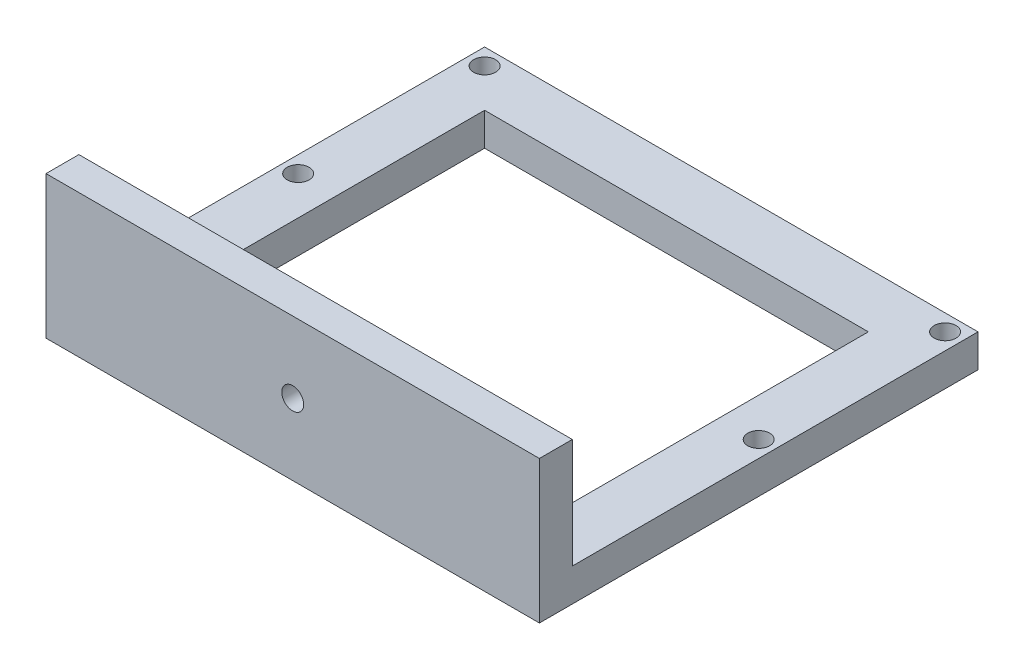
ISO-10303-21;
HEADER;
FILE_DESCRIPTION(('STEP AP214'),'2;1');
FILE_NAME('part.step','',(''),(''),'','','');
FILE_SCHEMA(('AUTOMOTIVE_DESIGN { 1 0 10303 214 1 1 1 1 }'));
ENDSEC;
DATA;
#1=APPLICATION_CONTEXT('core data for automotive mechanical design processes');
#2=APPLICATION_PROTOCOL_DEFINITION('international standard','automotive_design',2000,#1);
#3=PRODUCT_CONTEXT('',#1,'mechanical');
#4=PRODUCT('Part','Part','',(#3));
#5=PRODUCT_RELATED_PRODUCT_CATEGORY('part','',(#4));
#6=PRODUCT_DEFINITION_FORMATION('','',#4);
#7=PRODUCT_DEFINITION_CONTEXT('part definition',#1,'design');
#8=PRODUCT_DEFINITION('design','',#6,#7);
#9=PRODUCT_DEFINITION_SHAPE('','',#8);
#10=(LENGTH_UNIT() NAMED_UNIT(*) SI_UNIT(.MILLI.,.METRE.));
#11=(NAMED_UNIT(*) PLANE_ANGLE_UNIT() SI_UNIT($,.RADIAN.));
#12=(NAMED_UNIT(*) SI_UNIT($,.STERADIAN.) SOLID_ANGLE_UNIT());
#13=UNCERTAINTY_MEASURE_WITH_UNIT(LENGTH_MEASURE(1.E-05),#10,'distance_accuracy_value','');
#14=(GEOMETRIC_REPRESENTATION_CONTEXT(3) GLOBAL_UNCERTAINTY_ASSIGNED_CONTEXT((#13)) GLOBAL_UNIT_ASSIGNED_CONTEXT((#10,
#11,#12)) REPRESENTATION_CONTEXT('',''));
#15=CARTESIAN_POINT('',(0.,0.,0.));
#16=DIRECTION('',(0.,0.,1.));
#17=DIRECTION('',(1.,0.,0.));
#18=AXIS2_PLACEMENT_3D('',#15,#16,#17);
#19=CARTESIAN_POINT('',(0.,3.,-35.));
#20=DIRECTION('',(0.,0.,-1.));
#21=DIRECTION('',(-1.,0.,0.));
#22=AXIS2_PLACEMENT_3D('',#19,#20,#21);
#23=PLANE('',#22);
#24=DIRECTION('',(1.,0.,0.));
#25=VECTOR('',#24,1.);
#26=CARTESIAN_POINT('',(0.,0.,-35.));
#27=LINE('',#26,#25);
#28=CARTESIAN_POINT('',(-40.,0.,-35.));
#29=VERTEX_POINT('',#28);
#30=CARTESIAN_POINT('',(-5.,0.,-35.));
#31=VERTEX_POINT('',#30);
#32=EDGE_CURVE('E168',#29,#31,#27,.T.);
#33=ORIENTED_EDGE('',*,*,#32,.T.);
#34=DIRECTION('',(0.,-1.,0.));
#35=VECTOR('',#34,1.);
#36=CARTESIAN_POINT('',(-5.,3.,-35.));
#37=LINE('',#36,#35);
#38=CARTESIAN_POINT('',(-5.,3.,-35.));
#39=VERTEX_POINT('',#38);
#40=EDGE_CURVE('E11',#39,#31,#37,.T.);
#41=ORIENTED_EDGE('',*,*,#40,.F.);
#42=DIRECTION('',(1.,0.,0.));
#43=VECTOR('',#42,1.);
#44=CARTESIAN_POINT('',(0.,3.,-35.));
#45=LINE('',#44,#43);
#46=CARTESIAN_POINT('',(-40.,3.,-35.));
#47=VERTEX_POINT('',#46);
#48=EDGE_CURVE('E139',#47,#39,#45,.T.);
#49=ORIENTED_EDGE('',*,*,#48,.F.);
#50=DIRECTION('',(0.,-1.,0.));
#51=VECTOR('',#50,1.);
#52=CARTESIAN_POINT('',(-40.,3.,-35.));
#53=LINE('',#52,#51);
#54=EDGE_CURVE('E179',#47,#29,#53,.T.);
#55=ORIENTED_EDGE('',*,*,#54,.T.);
#56=EDGE_LOOP('',(#33,#41,#49,#55));
#57=FACE_BOUND('',#56,.T.);
#58=ADVANCED_FACE('F47',(#57),#23,.F.);
#59=CARTESIAN_POINT('',(-5.,3.,0.));
#60=DIRECTION('',(-1.,0.,0.));
#61=DIRECTION('',(0.,0.,1.));
#62=AXIS2_PLACEMENT_3D('',#59,#60,#61);
#63=PLANE('',#62);
#64=DIRECTION('',(0.,0.,-1.));
#65=VECTOR('',#64,1.);
#66=CARTESIAN_POINT('',(-5.,0.,0.));
#67=LINE('',#66,#65);
#68=CARTESIAN_POINT('',(-5.,0.,-4.99999999999999));
#69=VERTEX_POINT('',#68);
#70=EDGE_CURVE('E128',#69,#31,#67,.T.);
#71=ORIENTED_EDGE('',*,*,#70,.F.);
#72=DIRECTION('',(0.,-1.,0.));
#73=VECTOR('',#72,1.);
#74=CARTESIAN_POINT('',(-5.,3.,-4.99999999999999));
#75=LINE('',#74,#73);
#76=CARTESIAN_POINT('',(-5.,3.,-4.99999999999999));
#77=VERTEX_POINT('',#76);
#78=EDGE_CURVE('E57',#77,#69,#75,.T.);
#79=ORIENTED_EDGE('',*,*,#78,.F.);
#80=DIRECTION('',(0.,0.,-1.));
#81=VECTOR('',#80,1.);
#82=CARTESIAN_POINT('',(-5.,3.,0.));
#83=LINE('',#82,#81);
#84=EDGE_CURVE('E126',#77,#39,#83,.T.);
#85=ORIENTED_EDGE('',*,*,#84,.T.);
#86=ORIENTED_EDGE('',*,*,#40,.T.);
#87=EDGE_LOOP('',(#71,#79,#85,#86));
#88=FACE_BOUND('',#87,.T.);
#89=ADVANCED_FACE('F125',(#88),#63,.T.);
#90=CARTESIAN_POINT('',(0.,3.,-4.99999999999999));
#91=DIRECTION('',(0.,0.,-1.));
#92=DIRECTION('',(-1.,0.,0.));
#93=AXIS2_PLACEMENT_3D('',#90,#91,#92);
#94=PLANE('',#93);
#95=DIRECTION('',(1.,0.,0.));
#96=VECTOR('',#95,1.);
#97=CARTESIAN_POINT('',(0.,0.,-4.99999999999999));
#98=LINE('',#97,#96);
#99=CARTESIAN_POINT('',(-40.,0.,-4.99999999999999));
#100=VERTEX_POINT('',#99);
#101=EDGE_CURVE('E174',#100,#69,#98,.T.);
#102=ORIENTED_EDGE('',*,*,#101,.F.);
#103=DIRECTION('',(0.,-1.,0.));
#104=VECTOR('',#103,1.);
#105=CARTESIAN_POINT('',(-40.,3.,-4.99999999999999));
#106=LINE('',#105,#104);
#107=CARTESIAN_POINT('',(-40.,3.,-4.99999999999999));
#108=VERTEX_POINT('',#107);
#109=EDGE_CURVE('E134',#108,#100,#106,.T.);
#110=ORIENTED_EDGE('',*,*,#109,.F.);
#111=DIRECTION('',(1.,0.,0.));
#112=VECTOR('',#111,1.);
#113=CARTESIAN_POINT('',(0.,3.,-4.99999999999999));
#114=LINE('',#113,#112);
#115=EDGE_CURVE('E137',#108,#77,#114,.T.);
#116=ORIENTED_EDGE('',*,*,#115,.T.);
#117=ORIENTED_EDGE('',*,*,#78,.T.);
#118=EDGE_LOOP('',(#102,#110,#116,#117));
#119=FACE_BOUND('',#118,.T.);
#120=ADVANCED_FACE('F143',(#119),#94,.T.);
#121=CARTESIAN_POINT('',(0.,3.,0.));
#122=DIRECTION('',(-1.,0.,0.));
#123=DIRECTION('',(0.,0.,1.));
#124=AXIS2_PLACEMENT_3D('',#121,#122,#123);
#125=PLANE('',#124);
#126=DIRECTION('',(0.,0.,-1.));
#127=VECTOR('',#126,1.);
#128=CARTESIAN_POINT('',(0.,0.,0.));
#129=LINE('',#128,#127);
#130=CARTESIAN_POINT('',(0.,0.,0.));
#131=VERTEX_POINT('',#130);
#132=CARTESIAN_POINT('',(0.,0.,-40.));
#133=VERTEX_POINT('',#132);
#134=EDGE_CURVE('E151',#131,#133,#129,.T.);
#135=ORIENTED_EDGE('',*,*,#134,.T.);
#136=DIRECTION('',(0.,-1.,0.));
#137=VECTOR('',#136,1.);
#138=CARTESIAN_POINT('',(0.,3.,-40.));
#139=LINE('',#138,#137);
#140=CARTESIAN_POINT('',(0.,3.,-40.));
#141=VERTEX_POINT('',#140);
#142=EDGE_CURVE('E51',#141,#133,#139,.T.);
#143=ORIENTED_EDGE('',*,*,#142,.F.);
#144=DIRECTION('',(0.,0.,-1.));
#145=VECTOR('',#144,1.);
#146=CARTESIAN_POINT('',(0.,3.,0.));
#147=LINE('',#146,#145);
#148=CARTESIAN_POINT('',(0.,3.,-3.));
#149=VERTEX_POINT('',#148);
#150=EDGE_CURVE('E111',#149,#141,#147,.T.);
#151=ORIENTED_EDGE('',*,*,#150,.F.);
#152=DIRECTION('',(0.,-1.,0.));
#153=VECTOR('',#152,1.);
#154=CARTESIAN_POINT('',(0.,13.,-3.));
#155=LINE('',#154,#153);
#156=CARTESIAN_POINT('',(0.,13.,-3.));
#157=VERTEX_POINT('',#156);
#158=EDGE_CURVE('E304',#157,#149,#155,.T.);
#159=ORIENTED_EDGE('',*,*,#158,.F.);
#160=DIRECTION('',(0.,0.,-1.));
#161=VECTOR('',#160,1.);
#162=CARTESIAN_POINT('',(0.,13.,0.));
#163=LINE('',#162,#161);
#164=CARTESIAN_POINT('',(0.,13.,0.));
#165=VERTEX_POINT('',#164);
#166=EDGE_CURVE('E285',#165,#157,#163,.T.);
#167=ORIENTED_EDGE('',*,*,#166,.F.);
#168=DIRECTION('',(0.,-1.,0.));
#169=VECTOR('',#168,1.);
#170=CARTESIAN_POINT('',(0.,3.,0.));
#171=LINE('',#170,#169);
#172=EDGE_CURVE('E147',#165,#131,#171,.T.);
#173=ORIENTED_EDGE('',*,*,#172,.T.);
#174=EDGE_LOOP('',(#135,#143,#151,#159,#167,#173));
#175=FACE_BOUND('',#174,.T.);
#176=ADVANCED_FACE('F49',(#175),#125,.F.);
#177=CARTESIAN_POINT('',(0.,3.,-40.));
#178=DIRECTION('',(0.,0.,1.));
#179=DIRECTION('',(1.,0.,0.));
#180=AXIS2_PLACEMENT_3D('',#177,#178,#179);
#181=PLANE('',#180);
#182=DIRECTION('',(-1.,0.,0.));
#183=VECTOR('',#182,1.);
#184=CARTESIAN_POINT('',(0.,0.,-40.));
#185=LINE('',#184,#183);
#186=CARTESIAN_POINT('',(-45.,0.,-40.));
#187=VERTEX_POINT('',#186);
#188=EDGE_CURVE('E155',#133,#187,#185,.T.);
#189=ORIENTED_EDGE('',*,*,#188,.T.);
#190=DIRECTION('',(0.,-1.,0.));
#191=VECTOR('',#190,1.);
#192=CARTESIAN_POINT('',(-45.,3.,-40.));
#193=LINE('',#192,#191);
#194=CARTESIAN_POINT('',(-45.,3.,-40.));
#195=VERTEX_POINT('',#194);
#196=EDGE_CURVE('E188',#195,#187,#193,.T.);
#197=ORIENTED_EDGE('',*,*,#196,.F.);
#198=DIRECTION('',(-1.,0.,0.));
#199=VECTOR('',#198,1.);
#200=CARTESIAN_POINT('',(0.,3.,-40.));
#201=LINE('',#200,#199);
#202=EDGE_CURVE('E198',#141,#195,#201,.T.);
#203=ORIENTED_EDGE('',*,*,#202,.F.);
#204=ORIENTED_EDGE('',*,*,#142,.T.);
#205=EDGE_LOOP('',(#189,#197,#203,#204));
#206=FACE_BOUND('',#205,.T.);
#207=ADVANCED_FACE('F197',(#206),#181,.F.);
#208=CARTESIAN_POINT('',(-45.,3.,0.));
#209=DIRECTION('',(-1.,0.,0.));
#210=DIRECTION('',(0.,0.,1.));
#211=AXIS2_PLACEMENT_3D('',#208,#209,#210);
#212=PLANE('',#211);
#213=DIRECTION('',(0.,0.,-1.));
#214=VECTOR('',#213,1.);
#215=CARTESIAN_POINT('',(-45.,0.,0.));
#216=LINE('',#215,#214);
#217=CARTESIAN_POINT('',(-45.,0.,0.));
#218=VERTEX_POINT('',#217);
#219=EDGE_CURVE('E160',#218,#187,#216,.T.);
#220=ORIENTED_EDGE('',*,*,#219,.F.);
#221=DIRECTION('',(0.,-1.,0.));
#222=VECTOR('',#221,1.);
#223=CARTESIAN_POINT('',(-45.,3.,0.));
#224=LINE('',#223,#222);
#225=CARTESIAN_POINT('',(-45.,13.,0.));
#226=VERTEX_POINT('',#225);
#227=EDGE_CURVE('E186',#226,#218,#224,.T.);
#228=ORIENTED_EDGE('',*,*,#227,.F.);
#229=DIRECTION('',(0.,0.,1.));
#230=VECTOR('',#229,1.);
#231=CARTESIAN_POINT('',(-45.,13.,0.));
#232=LINE('',#231,#230);
#233=CARTESIAN_POINT('',(-45.,13.,-2.99999999999999));
#234=VERTEX_POINT('',#233);
#235=EDGE_CURVE('E293',#234,#226,#232,.T.);
#236=ORIENTED_EDGE('',*,*,#235,.F.);
#237=DIRECTION('',(0.,-1.,0.));
#238=VECTOR('',#237,1.);
#239=CARTESIAN_POINT('',(-45.,13.,-2.99999999999999));
#240=LINE('',#239,#238);
#241=CARTESIAN_POINT('',(-45.,3.,-2.99999999999999));
#242=VERTEX_POINT('',#241);
#243=EDGE_CURVE('E298',#234,#242,#240,.T.);
#244=ORIENTED_EDGE('',*,*,#243,.T.);
#245=DIRECTION('',(0.,0.,-1.));
#246=VECTOR('',#245,1.);
#247=CARTESIAN_POINT('',(-45.,3.,0.));
#248=LINE('',#247,#246);
#249=EDGE_CURVE('E343',#242,#195,#248,.T.);
#250=ORIENTED_EDGE('',*,*,#249,.T.);
#251=ORIENTED_EDGE('',*,*,#196,.T.);
#252=EDGE_LOOP('',(#220,#228,#236,#244,#250,#251));
#253=FACE_BOUND('',#252,.T.);
#254=ADVANCED_FACE('F216',(#253),#212,.T.);
#255=CARTESIAN_POINT('',(0.,3.,0.));
#256=DIRECTION('',(0.,0.,1.));
#257=DIRECTION('',(1.,0.,0.));
#258=AXIS2_PLACEMENT_3D('',#255,#256,#257);
#259=PLANE('',#258);
#260=CARTESIAN_POINT('',(-22.5,6.5,0.));
#261=DIRECTION('',(0.,0.,1.));
#262=DIRECTION('',(1.,0.,0.));
#263=AXIS2_PLACEMENT_3D('',#260,#261,#262);
#264=CIRCLE('',#263,0.999999999999987);
#265=CARTESIAN_POINT('',(-21.5,6.5,0.));
#266=VERTEX_POINT('',#265);
#267=EDGE_CURVE('E276',#266,#266,#264,.T.);
#268=ORIENTED_EDGE('',*,*,#267,.F.);
#269=EDGE_LOOP('',(#268));
#270=FACE_BOUND('',#269,.T.);
#271=DIRECTION('',(-1.,0.,0.));
#272=VECTOR('',#271,1.);
#273=CARTESIAN_POINT('',(0.,0.,0.));
#274=LINE('',#273,#272);
#275=EDGE_CURVE('E164',#131,#218,#274,.T.);
#276=ORIENTED_EDGE('',*,*,#275,.F.);
#277=ORIENTED_EDGE('',*,*,#172,.F.);
#278=DIRECTION('',(1.,0.,0.));
#279=VECTOR('',#278,1.);
#280=CARTESIAN_POINT('',(0.,13.,0.));
#281=LINE('',#280,#279);
#282=EDGE_CURVE('E213',#226,#165,#281,.T.);
#283=ORIENTED_EDGE('',*,*,#282,.F.);
#284=ORIENTED_EDGE('',*,*,#227,.T.);
#285=EDGE_LOOP('',(#276,#277,#283,#284));
#286=FACE_BOUND('',#285,.T.);
#287=ADVANCED_FACE('F208',(#270,#286),#259,.T.);
#288=CARTESIAN_POINT('',(-40.,3.,0.));
#289=DIRECTION('',(-1.,0.,0.));
#290=DIRECTION('',(0.,0.,1.));
#291=AXIS2_PLACEMENT_3D('',#288,#289,#290);
#292=PLANE('',#291);
#293=DIRECTION('',(0.,0.,-1.));
#294=VECTOR('',#293,1.);
#295=CARTESIAN_POINT('',(-40.,0.,0.));
#296=LINE('',#295,#294);
#297=EDGE_CURVE('E106',#100,#29,#296,.T.);
#298=ORIENTED_EDGE('',*,*,#297,.T.);
#299=ORIENTED_EDGE('',*,*,#54,.F.);
#300=DIRECTION('',(0.,0.,-1.));
#301=VECTOR('',#300,1.);
#302=CARTESIAN_POINT('',(-40.,3.,0.));
#303=LINE('',#302,#301);
#304=EDGE_CURVE('E74',#108,#47,#303,.T.);
#305=ORIENTED_EDGE('',*,*,#304,.F.);
#306=ORIENTED_EDGE('',*,*,#109,.T.);
#307=EDGE_LOOP('',(#298,#299,#305,#306));
#308=FACE_BOUND('',#307,.T.);
#309=ADVANCED_FACE('F224',(#308),#292,.F.);
#310=CARTESIAN_POINT('',(0.,3.,0.));
#311=DIRECTION('',(0.,1.,0.));
#312=DIRECTION('',(0.,0.,1.));
#313=AXIS2_PLACEMENT_3D('',#310,#311,#312);
#314=PLANE('',#313);
#315=DIRECTION('',(-1.,0.,0.));
#316=VECTOR('',#315,1.);
#317=CARTESIAN_POINT('',(0.,3.,-3.));
#318=LINE('',#317,#316);
#319=EDGE_CURVE('E65',#149,#242,#318,.T.);
#320=ORIENTED_EDGE('',*,*,#319,.F.);
#321=ORIENTED_EDGE('',*,*,#150,.T.);
#322=ORIENTED_EDGE('',*,*,#202,.T.);
#323=ORIENTED_EDGE('',*,*,#249,.F.);
#324=EDGE_LOOP('',(#320,#321,#322,#323));
#325=FACE_BOUND('',#324,.T.);
#326=CARTESIAN_POINT('',(-1.5,3.,-38.5));
#327=DIRECTION('',(0.,1.,0.));
#328=DIRECTION('',(0.,0.,1.));
#329=AXIS2_PLACEMENT_3D('',#326,#327,#328);
#330=CIRCLE('',#329,0.999999999999998);
#331=CARTESIAN_POINT('',(-1.5,3.,-37.5));
#332=VERTEX_POINT('',#331);
#333=EDGE_CURVE('E312',#332,#332,#330,.T.);
#334=ORIENTED_EDGE('',*,*,#333,.F.);
#335=EDGE_LOOP('',(#334));
#336=FACE_BOUND('',#335,.T.);
#337=CARTESIAN_POINT('',(-43.5,3.,-38.5));
#338=DIRECTION('',(0.,1.,0.));
#339=DIRECTION('',(0.,0.,1.));
#340=AXIS2_PLACEMENT_3D('',#337,#338,#339);
#341=CIRCLE('',#340,0.999999999999997);
#342=CARTESIAN_POINT('',(-43.5,3.,-37.5));
#343=VERTEX_POINT('',#342);
#344=EDGE_CURVE('E320',#343,#343,#341,.T.);
#345=ORIENTED_EDGE('',*,*,#344,.F.);
#346=EDGE_LOOP('',(#345));
#347=FACE_BOUND('',#346,.T.);
#348=CARTESIAN_POINT('',(-1.5,3.,-21.5));
#349=DIRECTION('',(0.,1.,0.));
#350=DIRECTION('',(0.,0.,1.));
#351=AXIS2_PLACEMENT_3D('',#348,#349,#350);
#352=CIRCLE('',#351,0.999999999999998);
#353=CARTESIAN_POINT('',(-1.5,3.,-20.5));
#354=VERTEX_POINT('',#353);
#355=EDGE_CURVE('E328',#354,#354,#352,.T.);
#356=ORIENTED_EDGE('',*,*,#355,.F.);
#357=EDGE_LOOP('',(#356));
#358=FACE_BOUND('',#357,.T.);
#359=CARTESIAN_POINT('',(-43.5,3.,-21.5));
#360=DIRECTION('',(0.,1.,0.));
#361=DIRECTION('',(0.,0.,1.));
#362=AXIS2_PLACEMENT_3D('',#359,#360,#361);
#363=CIRCLE('',#362,0.999999999999997);
#364=CARTESIAN_POINT('',(-43.5,3.,-20.5));
#365=VERTEX_POINT('',#364);
#366=EDGE_CURVE('E156',#365,#365,#363,.T.);
#367=ORIENTED_EDGE('',*,*,#366,.F.);
#368=EDGE_LOOP('',(#367));
#369=FACE_BOUND('',#368,.T.);
#370=ORIENTED_EDGE('',*,*,#48,.T.);
#371=ORIENTED_EDGE('',*,*,#84,.F.);
#372=ORIENTED_EDGE('',*,*,#115,.F.);
#373=ORIENTED_EDGE('',*,*,#304,.T.);
#374=EDGE_LOOP('',(#370,#371,#372,#373));
#375=FACE_BOUND('',#374,.T.);
#376=ADVANCED_FACE('F136',(#325,#336,#347,#358,#369,#375),#314,.T.);
#377=CARTESIAN_POINT('',(0.,0.,0.));
#378=DIRECTION('',(0.,1.,0.));
#379=DIRECTION('',(0.,0.,1.));
#380=AXIS2_PLACEMENT_3D('',#377,#378,#379);
#381=PLANE('',#380);
#382=CARTESIAN_POINT('',(-1.5,0.,-38.5));
#383=DIRECTION('',(0.,-1.,0.));
#384=DIRECTION('',(0.,0.,-1.));
#385=AXIS2_PLACEMENT_3D('',#382,#383,#384);
#386=CIRCLE('',#385,0.999999999999999);
#387=CARTESIAN_POINT('',(-1.5,0.,-39.5));
#388=VERTEX_POINT('',#387);
#389=EDGE_CURVE('E308',#388,#388,#386,.T.);
#390=ORIENTED_EDGE('',*,*,#389,.F.);
#391=EDGE_LOOP('',(#390));
#392=FACE_BOUND('',#391,.T.);
#393=CARTESIAN_POINT('',(-43.5,0.,-38.5));
#394=DIRECTION('',(0.,-1.,0.));
#395=DIRECTION('',(0.,0.,-1.));
#396=AXIS2_PLACEMENT_3D('',#393,#394,#395);
#397=CIRCLE('',#396,1.);
#398=CARTESIAN_POINT('',(-43.5,0.,-39.5));
#399=VERTEX_POINT('',#398);
#400=EDGE_CURVE('E316',#399,#399,#397,.T.);
#401=ORIENTED_EDGE('',*,*,#400,.F.);
#402=EDGE_LOOP('',(#401));
#403=FACE_BOUND('',#402,.T.);
#404=CARTESIAN_POINT('',(-1.5,0.,-21.5));
#405=DIRECTION('',(0.,-1.,0.));
#406=DIRECTION('',(0.,0.,-1.));
#407=AXIS2_PLACEMENT_3D('',#404,#405,#406);
#408=CIRCLE('',#407,0.999999999999999);
#409=CARTESIAN_POINT('',(-1.5,0.,-22.5));
#410=VERTEX_POINT('',#409);
#411=EDGE_CURVE('E324',#410,#410,#408,.T.);
#412=ORIENTED_EDGE('',*,*,#411,.F.);
#413=EDGE_LOOP('',(#412));
#414=FACE_BOUND('',#413,.T.);
#415=CARTESIAN_POINT('',(-43.5,0.,-21.5));
#416=DIRECTION('',(0.,-1.,0.));
#417=DIRECTION('',(0.,0.,-1.));
#418=AXIS2_PLACEMENT_3D('',#415,#416,#417);
#419=CIRCLE('',#418,1.);
#420=CARTESIAN_POINT('',(-43.5,0.,-22.5));
#421=VERTEX_POINT('',#420);
#422=EDGE_CURVE('E332',#421,#421,#419,.T.);
#423=ORIENTED_EDGE('',*,*,#422,.F.);
#424=EDGE_LOOP('',(#423));
#425=FACE_BOUND('',#424,.T.);
#426=ORIENTED_EDGE('',*,*,#134,.F.);
#427=ORIENTED_EDGE('',*,*,#275,.T.);
#428=ORIENTED_EDGE('',*,*,#219,.T.);
#429=ORIENTED_EDGE('',*,*,#188,.F.);
#430=EDGE_LOOP('',(#426,#427,#428,#429));
#431=FACE_BOUND('',#430,.T.);
#432=ORIENTED_EDGE('',*,*,#32,.F.);
#433=ORIENTED_EDGE('',*,*,#297,.F.);
#434=ORIENTED_EDGE('',*,*,#101,.T.);
#435=ORIENTED_EDGE('',*,*,#70,.T.);
#436=EDGE_LOOP('',(#432,#433,#434,#435));
#437=FACE_BOUND('',#436,.T.);
#438=ADVANCED_FACE('F205',(#392,#403,#414,#425,#431,#437),#381,.F.);
#439=CARTESIAN_POINT('',(-43.5,0.,-21.5));
#440=DIRECTION('',(0.,-1.,0.));
#441=DIRECTION('',(0.,0.,-1.));
#442=AXIS2_PLACEMENT_3D('',#439,#440,#441);
#443=CYLINDRICAL_SURFACE('',#442,0.999999999999997);
#444=ORIENTED_EDGE('',*,*,#366,.T.);
#445=EDGE_LOOP('',(#444));
#446=FACE_BOUND('',#445,.T.);
#447=ORIENTED_EDGE('',*,*,#422,.T.);
#448=EDGE_LOOP('',(#447));
#449=FACE_BOUND('',#448,.T.);
#450=ADVANCED_FACE('F242',(#446,#449),#443,.F.);
#451=CARTESIAN_POINT('',(-1.5,0.,-21.5));
#452=DIRECTION('',(0.,-1.,0.));
#453=DIRECTION('',(0.,0.,-1.));
#454=AXIS2_PLACEMENT_3D('',#451,#452,#453);
#455=CYLINDRICAL_SURFACE('',#454,0.999999999999998);
#456=ORIENTED_EDGE('',*,*,#355,.T.);
#457=EDGE_LOOP('',(#456));
#458=FACE_BOUND('',#457,.T.);
#459=ORIENTED_EDGE('',*,*,#411,.T.);
#460=EDGE_LOOP('',(#459));
#461=FACE_BOUND('',#460,.T.);
#462=ADVANCED_FACE('F247',(#458,#461),#455,.F.);
#463=CARTESIAN_POINT('',(-43.5,0.,-38.5));
#464=DIRECTION('',(0.,-1.,0.));
#465=DIRECTION('',(0.,0.,-1.));
#466=AXIS2_PLACEMENT_3D('',#463,#464,#465);
#467=CYLINDRICAL_SURFACE('',#466,0.999999999999997);
#468=ORIENTED_EDGE('',*,*,#344,.T.);
#469=EDGE_LOOP('',(#468));
#470=FACE_BOUND('',#469,.T.);
#471=ORIENTED_EDGE('',*,*,#400,.T.);
#472=EDGE_LOOP('',(#471));
#473=FACE_BOUND('',#472,.T.);
#474=ADVANCED_FACE('F251',(#470,#473),#467,.F.);
#475=CARTESIAN_POINT('',(-1.5,0.,-38.5));
#476=DIRECTION('',(0.,-1.,0.));
#477=DIRECTION('',(0.,0.,-1.));
#478=AXIS2_PLACEMENT_3D('',#475,#476,#477);
#479=CYLINDRICAL_SURFACE('',#478,0.999999999999998);
#480=ORIENTED_EDGE('',*,*,#333,.T.);
#481=EDGE_LOOP('',(#480));
#482=FACE_BOUND('',#481,.T.);
#483=ORIENTED_EDGE('',*,*,#389,.T.);
#484=EDGE_LOOP('',(#483));
#485=FACE_BOUND('',#484,.T.);
#486=ADVANCED_FACE('F255',(#482,#485),#479,.F.);
#487=CARTESIAN_POINT('',(0.,13.,-3.));
#488=DIRECTION('',(0.,0.,1.));
#489=DIRECTION('',(1.,0.,0.));
#490=AXIS2_PLACEMENT_3D('',#487,#488,#489);
#491=PLANE('',#490);
#492=CARTESIAN_POINT('',(-22.5,6.5,-3.));
#493=DIRECTION('',(0.,0.,-1.));
#494=DIRECTION('',(-1.,0.,0.));
#495=AXIS2_PLACEMENT_3D('',#492,#493,#494);
#496=CIRCLE('',#495,0.999999999999987);
#497=CARTESIAN_POINT('',(-23.5,6.5,-3.));
#498=VERTEX_POINT('',#497);
#499=EDGE_CURVE('E279',#498,#498,#496,.T.);
#500=ORIENTED_EDGE('',*,*,#499,.F.);
#501=EDGE_LOOP('',(#500));
#502=FACE_BOUND('',#501,.T.);
#503=ORIENTED_EDGE('',*,*,#319,.T.);
#504=ORIENTED_EDGE('',*,*,#243,.F.);
#505=DIRECTION('',(-1.,0.,0.));
#506=VECTOR('',#505,1.);
#507=CARTESIAN_POINT('',(0.,13.,-3.));
#508=LINE('',#507,#506);
#509=EDGE_CURVE('E289',#157,#234,#508,.T.);
#510=ORIENTED_EDGE('',*,*,#509,.F.);
#511=ORIENTED_EDGE('',*,*,#158,.T.);
#512=EDGE_LOOP('',(#503,#504,#510,#511));
#513=FACE_BOUND('',#512,.T.);
#514=ADVANCED_FACE('F259',(#502,#513),#491,.F.);
#515=CARTESIAN_POINT('',(0.,13.,0.));
#516=DIRECTION('',(0.,1.,0.));
#517=DIRECTION('',(0.,0.,1.));
#518=AXIS2_PLACEMENT_3D('',#515,#516,#517);
#519=PLANE('',#518);
#520=ORIENTED_EDGE('',*,*,#166,.T.);
#521=ORIENTED_EDGE('',*,*,#509,.T.);
#522=ORIENTED_EDGE('',*,*,#235,.T.);
#523=ORIENTED_EDGE('',*,*,#282,.T.);
#524=EDGE_LOOP('',(#520,#521,#522,#523));
#525=FACE_BOUND('',#524,.T.);
#526=ADVANCED_FACE('F263',(#525),#519,.T.);
#527=CARTESIAN_POINT('',(-22.5,6.5,-3.));
#528=DIRECTION('',(0.,0.,-1.));
#529=DIRECTION('',(-1.,0.,0.));
#530=AXIS2_PLACEMENT_3D('',#527,#528,#529);
#531=CYLINDRICAL_SURFACE('',#530,0.999999999999987);
#532=ORIENTED_EDGE('',*,*,#267,.T.);
#533=EDGE_LOOP('',(#532));
#534=FACE_BOUND('',#533,.T.);
#535=ORIENTED_EDGE('',*,*,#499,.T.);
#536=EDGE_LOOP('',(#535));
#537=FACE_BOUND('',#536,.T.);
#538=ADVANCED_FACE('F267',(#534,#537),#531,.F.);
#539=CLOSED_SHELL('',(#58,#89,#120,#176,#207,#254,#287,#309,#376,#438,#450,#462,#474,#486,#514,
#526,#538));
#540=MANIFOLD_SOLID_BREP('B2',#539);
#541=ADVANCED_BREP_SHAPE_REPRESENTATION('',(#18,#540),#14);
#542=SHAPE_DEFINITION_REPRESENTATION(#9,#541);
ENDSEC;
END-ISO-10303-21;
